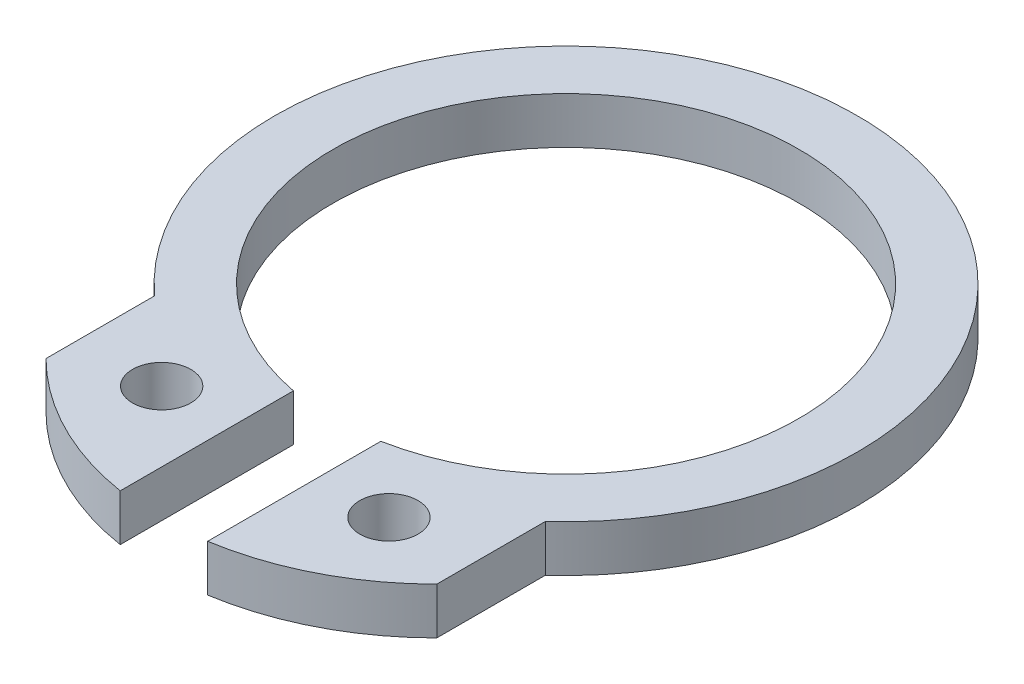
ISO-10303-21;
HEADER;
FILE_DESCRIPTION(('STEP AP214'),'2;1');
FILE_NAME('part.step','',(''),(''),'','','');
FILE_SCHEMA(('AUTOMOTIVE_DESIGN { 1 0 10303 214 1 1 1 1 }'));
ENDSEC;
DATA;
#1=APPLICATION_CONTEXT('core data for automotive mechanical design processes');
#2=APPLICATION_PROTOCOL_DEFINITION('international standard','automotive_design',2000,#1);
#3=PRODUCT_CONTEXT('',#1,'mechanical');
#4=PRODUCT('Part','Part','',(#3));
#5=PRODUCT_RELATED_PRODUCT_CATEGORY('part','',(#4));
#6=PRODUCT_DEFINITION_FORMATION('','',#4);
#7=PRODUCT_DEFINITION_CONTEXT('part definition',#1,'design');
#8=PRODUCT_DEFINITION('design','',#6,#7);
#9=PRODUCT_DEFINITION_SHAPE('','',#8);
#10=(LENGTH_UNIT() NAMED_UNIT(*) SI_UNIT(.MILLI.,.METRE.));
#11=(NAMED_UNIT(*) PLANE_ANGLE_UNIT() SI_UNIT($,.RADIAN.));
#12=(NAMED_UNIT(*) SI_UNIT($,.STERADIAN.) SOLID_ANGLE_UNIT());
#13=UNCERTAINTY_MEASURE_WITH_UNIT(LENGTH_MEASURE(1.E-05),#10,'distance_accuracy_value','');
#14=(GEOMETRIC_REPRESENTATION_CONTEXT(3) GLOBAL_UNCERTAINTY_ASSIGNED_CONTEXT((#13)) GLOBAL_UNIT_ASSIGNED_CONTEXT((#10,
#11,#12)) REPRESENTATION_CONTEXT('',''));
#15=CARTESIAN_POINT('',(0.,0.,0.));
#16=DIRECTION('',(0.,0.,1.));
#17=DIRECTION('',(1.,0.,0.));
#18=AXIS2_PLACEMENT_3D('',#15,#16,#17);
#19=CARTESIAN_POINT('',(0.,0.8,0.));
#20=DIRECTION('',(0.,-1.,0.));
#21=DIRECTION('',(0.,0.,-1.));
#22=AXIS2_PLACEMENT_3D('',#19,#20,#21);
#23=CYLINDRICAL_SURFACE('',#22,4.);
#24=CARTESIAN_POINT('',(0.,0.,0.));
#25=DIRECTION('',(0.,1.,0.));
#26=DIRECTION('',(0.,0.,1.));
#27=AXIS2_PLACEMENT_3D('',#24,#25,#26);
#28=CIRCLE('',#27,4.);
#29=CARTESIAN_POINT('',(0.750000000000001,0.,3.92905841137543));
#30=VERTEX_POINT('',#29);
#31=CARTESIAN_POINT('',(-0.749999999999999,0.,3.92905841137543));
#32=VERTEX_POINT('',#31);
#33=EDGE_CURVE('E152',#30,#32,#28,.T.);
#34=ORIENTED_EDGE('',*,*,#33,.F.);
#35=DIRECTION('',(0.,-1.,0.));
#36=VECTOR('',#35,1.);
#37=CARTESIAN_POINT('',(0.750000000000001,0.8,3.92905841137543));
#38=LINE('',#37,#36);
#39=CARTESIAN_POINT('',(0.750000000000001,0.8,3.92905841137543));
#40=VERTEX_POINT('',#39);
#41=EDGE_CURVE('E11',#40,#30,#38,.T.);
#42=ORIENTED_EDGE('',*,*,#41,.F.);
#43=CARTESIAN_POINT('',(0.,0.8,0.));
#44=DIRECTION('',(0.,1.,0.));
#45=DIRECTION('',(0.,0.,1.));
#46=AXIS2_PLACEMENT_3D('',#43,#44,#45);
#47=CIRCLE('',#46,4.);
#48=CARTESIAN_POINT('',(-0.749999999999999,0.8,3.92905841137543));
#49=VERTEX_POINT('',#48);
#50=EDGE_CURVE('E186',#40,#49,#47,.T.);
#51=ORIENTED_EDGE('',*,*,#50,.T.);
#52=DIRECTION('',(0.,-1.,0.));
#53=VECTOR('',#52,1.);
#54=CARTESIAN_POINT('',(-0.749999999999999,0.8,3.92905841137543));
#55=LINE('',#54,#53);
#56=EDGE_CURVE('E97',#49,#32,#55,.T.);
#57=ORIENTED_EDGE('',*,*,#56,.T.);
#58=EDGE_LOOP('',(#34,#42,#51,#57));
#59=FACE_BOUND('',#58,.T.);
#60=ADVANCED_FACE('F45',(#59),#23,.F.);
#61=CARTESIAN_POINT('',(0.750000000000001,0.8,0.));
#62=DIRECTION('',(-1.,0.,0.));
#63=DIRECTION('',(0.,0.,1.));
#64=AXIS2_PLACEMENT_3D('',#61,#62,#63);
#65=PLANE('',#64);
#66=DIRECTION('',(0.,0.,-1.));
#67=VECTOR('',#66,1.);
#68=CARTESIAN_POINT('',(0.750000000000001,0.,0.));
#69=LINE('',#68,#67);
#70=CARTESIAN_POINT('',(0.750000000000001,0.,6.90181330035172));
#71=VERTEX_POINT('',#70);
#72=EDGE_CURVE('E156',#71,#30,#69,.T.);
#73=ORIENTED_EDGE('',*,*,#72,.F.);
#74=DIRECTION('',(0.,-1.,0.));
#75=VECTOR('',#74,1.);
#76=CARTESIAN_POINT('',(0.750000000000001,0.8,6.90181330035172));
#77=LINE('',#76,#75);
#78=CARTESIAN_POINT('',(0.750000000000001,0.8,6.90181330035172));
#79=VERTEX_POINT('',#78);
#80=EDGE_CURVE('E54',#79,#71,#77,.T.);
#81=ORIENTED_EDGE('',*,*,#80,.F.);
#82=DIRECTION('',(0.,0.,-1.));
#83=VECTOR('',#82,1.);
#84=CARTESIAN_POINT('',(0.750000000000001,0.8,0.));
#85=LINE('',#84,#83);
#86=EDGE_CURVE('E215',#79,#40,#85,.T.);
#87=ORIENTED_EDGE('',*,*,#86,.T.);
#88=ORIENTED_EDGE('',*,*,#41,.T.);
#89=EDGE_LOOP('',(#73,#81,#87,#88));
#90=FACE_BOUND('',#89,.T.);
#91=ADVANCED_FACE('F214',(#90),#65,.T.);
#92=CARTESIAN_POINT('',(0.,0.8,2.21907270884503));
#93=DIRECTION('',(0.,-1.,0.));
#94=DIRECTION('',(0.,0.,-1.));
#95=AXIS2_PLACEMENT_3D('',#92,#93,#94);
#96=CYLINDRICAL_SURFACE('',#95,4.74242126422194);
#97=CARTESIAN_POINT('',(0.,0.,2.21907270884503));
#98=DIRECTION('',(0.,1.,0.));
#99=DIRECTION('',(0.,0.,1.));
#100=AXIS2_PLACEMENT_3D('',#97,#98,#99);
#101=CIRCLE('',#100,4.74242126422194);
#102=CARTESIAN_POINT('',(3.35339823517462,0.,5.57247094401964));
#103=VERTEX_POINT('',#102);
#104=EDGE_CURVE('E160',#71,#103,#101,.T.);
#105=ORIENTED_EDGE('',*,*,#104,.T.);
#106=DIRECTION('',(0.,-1.,0.));
#107=VECTOR('',#106,1.);
#108=CARTESIAN_POINT('',(3.35339823517462,0.8,5.57247094401964));
#109=LINE('',#108,#107);
#110=CARTESIAN_POINT('',(3.35339823517462,0.8,5.57247094401964));
#111=VERTEX_POINT('',#110);
#112=EDGE_CURVE('E196',#111,#103,#109,.T.);
#113=ORIENTED_EDGE('',*,*,#112,.F.);
#114=CARTESIAN_POINT('',(0.,0.8,2.21907270884503));
#115=DIRECTION('',(0.,1.,0.));
#116=DIRECTION('',(0.,0.,1.));
#117=AXIS2_PLACEMENT_3D('',#114,#115,#116);
#118=CIRCLE('',#117,4.74242126422194);
#119=EDGE_CURVE('E204',#79,#111,#118,.T.);
#120=ORIENTED_EDGE('',*,*,#119,.F.);
#121=ORIENTED_EDGE('',*,*,#80,.T.);
#122=EDGE_LOOP('',(#105,#113,#120,#121));
#123=FACE_BOUND('',#122,.T.);
#124=ADVANCED_FACE('F202',(#123),#96,.T.);
#125=CARTESIAN_POINT('',(3.35339823517462,0.8,0.));
#126=DIRECTION('',(1.,0.,0.));
#127=DIRECTION('',(0.,0.,-1.));
#128=AXIS2_PLACEMENT_3D('',#125,#126,#127);
#129=PLANE('',#128);
#130=DIRECTION('',(0.,0.,1.));
#131=VECTOR('',#130,1.);
#132=CARTESIAN_POINT('',(3.35339823517462,0.,0.));
#133=LINE('',#132,#131);
#134=CARTESIAN_POINT('',(3.35339823517462,0.,3.70873567086248));
#135=VERTEX_POINT('',#134);
#136=EDGE_CURVE('E164',#135,#103,#133,.T.);
#137=ORIENTED_EDGE('',*,*,#136,.F.);
#138=DIRECTION('',(0.,-1.,0.));
#139=VECTOR('',#138,1.);
#140=CARTESIAN_POINT('',(3.35339823517462,0.8,3.70873567086248));
#141=LINE('',#140,#139);
#142=CARTESIAN_POINT('',(3.35339823517462,0.8,3.70873567086248));
#143=VERTEX_POINT('',#142);
#144=EDGE_CURVE('E193',#143,#135,#141,.T.);
#145=ORIENTED_EDGE('',*,*,#144,.F.);
#146=DIRECTION('',(0.,0.,1.));
#147=VECTOR('',#146,1.);
#148=CARTESIAN_POINT('',(3.35339823517462,0.8,0.));
#149=LINE('',#148,#147);
#150=EDGE_CURVE('E226',#143,#111,#149,.T.);
#151=ORIENTED_EDGE('',*,*,#150,.T.);
#152=ORIENTED_EDGE('',*,*,#112,.T.);
#153=EDGE_LOOP('',(#137,#145,#151,#152));
#154=FACE_BOUND('',#153,.T.);
#155=ADVANCED_FACE('F231',(#154),#129,.T.);
#156=CARTESIAN_POINT('',(0.,0.8,0.));
#157=DIRECTION('',(0.,-1.,0.));
#158=DIRECTION('',(0.,0.,-1.));
#159=AXIS2_PLACEMENT_3D('',#156,#157,#158);
#160=CYLINDRICAL_SURFACE('',#159,5.);
#161=CARTESIAN_POINT('',(0.,0.,0.));
#162=DIRECTION('',(0.,1.,0.));
#163=DIRECTION('',(0.,0.,1.));
#164=AXIS2_PLACEMENT_3D('',#161,#162,#163);
#165=CIRCLE('',#164,5.);
#166=CARTESIAN_POINT('',(-3.35339823517462,0.,3.70873567086248));
#167=VERTEX_POINT('',#166);
#168=EDGE_CURVE('E168',#135,#167,#165,.T.);
#169=ORIENTED_EDGE('',*,*,#168,.T.);
#170=DIRECTION('',(0.,-1.,0.));
#171=VECTOR('',#170,1.);
#172=CARTESIAN_POINT('',(-3.35339823517462,0.8,3.70873567086248));
#173=LINE('',#172,#171);
#174=CARTESIAN_POINT('',(-3.35339823517462,0.8,3.70873567086248));
#175=VERTEX_POINT('',#174);
#176=EDGE_CURVE('E134',#175,#167,#173,.T.);
#177=ORIENTED_EDGE('',*,*,#176,.F.);
#178=CARTESIAN_POINT('',(0.,0.8,0.));
#179=DIRECTION('',(0.,1.,0.));
#180=DIRECTION('',(0.,0.,1.));
#181=AXIS2_PLACEMENT_3D('',#178,#179,#180);
#182=CIRCLE('',#181,5.);
#183=EDGE_CURVE('E123',#143,#175,#182,.T.);
#184=ORIENTED_EDGE('',*,*,#183,.F.);
#185=ORIENTED_EDGE('',*,*,#144,.T.);
#186=EDGE_LOOP('',(#169,#177,#184,#185));
#187=FACE_BOUND('',#186,.T.);
#188=ADVANCED_FACE('F233',(#187),#160,.T.);
#189=CARTESIAN_POINT('',(-3.35339823517462,0.8,0.));
#190=DIRECTION('',(1.,0.,0.));
#191=DIRECTION('',(0.,0.,-1.));
#192=AXIS2_PLACEMENT_3D('',#189,#190,#191);
#193=PLANE('',#192);
#194=DIRECTION('',(0.,0.,1.));
#195=VECTOR('',#194,1.);
#196=CARTESIAN_POINT('',(-3.35339823517462,0.,0.));
#197=LINE('',#196,#195);
#198=CARTESIAN_POINT('',(-3.35339823517462,0.,5.57247094401964));
#199=VERTEX_POINT('',#198);
#200=EDGE_CURVE('E132',#167,#199,#197,.T.);
#201=ORIENTED_EDGE('',*,*,#200,.T.);
#202=DIRECTION('',(0.,-1.,0.));
#203=VECTOR('',#202,1.);
#204=CARTESIAN_POINT('',(-3.35339823517462,0.8,5.57247094401964));
#205=LINE('',#204,#203);
#206=CARTESIAN_POINT('',(-3.35339823517462,0.8,5.57247094401964));
#207=VERTEX_POINT('',#206);
#208=EDGE_CURVE('E129',#207,#199,#205,.T.);
#209=ORIENTED_EDGE('',*,*,#208,.F.);
#210=DIRECTION('',(0.,0.,1.));
#211=VECTOR('',#210,1.);
#212=CARTESIAN_POINT('',(-3.35339823517462,0.8,0.));
#213=LINE('',#212,#211);
#214=EDGE_CURVE('E115',#175,#207,#213,.T.);
#215=ORIENTED_EDGE('',*,*,#214,.F.);
#216=ORIENTED_EDGE('',*,*,#176,.T.);
#217=EDGE_LOOP('',(#201,#209,#215,#216));
#218=FACE_BOUND('',#217,.T.);
#219=ADVANCED_FACE('F130',(#218),#193,.F.);
#220=CARTESIAN_POINT('',(0.,0.8,2.21907270884503));
#221=DIRECTION('',(0.,-1.,0.));
#222=DIRECTION('',(0.,0.,-1.));
#223=AXIS2_PLACEMENT_3D('',#220,#221,#222);
#224=CYLINDRICAL_SURFACE('',#223,4.74242126422194);
#225=CARTESIAN_POINT('',(0.,0.,2.21907270884503));
#226=DIRECTION('',(0.,1.,0.));
#227=DIRECTION('',(0.,0.,1.));
#228=AXIS2_PLACEMENT_3D('',#225,#226,#227);
#229=CIRCLE('',#228,4.74242126422194);
#230=CARTESIAN_POINT('',(-0.749999999999999,0.,6.90181330035172));
#231=VERTEX_POINT('',#230);
#232=EDGE_CURVE('E90',#199,#231,#229,.T.);
#233=ORIENTED_EDGE('',*,*,#232,.T.);
#234=DIRECTION('',(0.,-1.,0.));
#235=VECTOR('',#234,1.);
#236=CARTESIAN_POINT('',(-0.749999999999999,0.8,6.90181330035172));
#237=LINE('',#236,#235);
#238=CARTESIAN_POINT('',(-0.749999999999999,0.8,6.90181330035172));
#239=VERTEX_POINT('',#238);
#240=EDGE_CURVE('E135',#239,#231,#237,.T.);
#241=ORIENTED_EDGE('',*,*,#240,.F.);
#242=CARTESIAN_POINT('',(0.,0.8,2.21907270884503));
#243=DIRECTION('',(0.,1.,0.));
#244=DIRECTION('',(0.,0.,1.));
#245=AXIS2_PLACEMENT_3D('',#242,#243,#244);
#246=CIRCLE('',#245,4.74242126422194);
#247=EDGE_CURVE('E120',#207,#239,#246,.T.);
#248=ORIENTED_EDGE('',*,*,#247,.F.);
#249=ORIENTED_EDGE('',*,*,#208,.T.);
#250=EDGE_LOOP('',(#233,#241,#248,#249));
#251=FACE_BOUND('',#250,.T.);
#252=ADVANCED_FACE('F137',(#251),#224,.T.);
#253=CARTESIAN_POINT('',(-1.95,0.8,4.99060976580415));
#254=DIRECTION('',(0.,-1.,0.));
#255=DIRECTION('',(0.,0.,-1.));
#256=AXIS2_PLACEMENT_3D('',#253,#254,#255);
#257=CYLINDRICAL_SURFACE('',#256,0.5);
#258=CARTESIAN_POINT('',(-1.95,0.8,4.99060976580415));
#259=DIRECTION('',(0.,1.,0.));
#260=DIRECTION('',(0.,0.,1.));
#261=AXIS2_PLACEMENT_3D('',#258,#259,#260);
#262=CIRCLE('',#261,0.5);
#263=CARTESIAN_POINT('',(-1.95,0.8,5.49060976580415));
#264=VERTEX_POINT('',#263);
#265=EDGE_CURVE('E141',#264,#264,#262,.T.);
#266=ORIENTED_EDGE('',*,*,#265,.T.);
#267=EDGE_LOOP('',(#266));
#268=FACE_BOUND('',#267,.T.);
#269=CARTESIAN_POINT('',(-1.95,0.,4.99060976580415));
#270=DIRECTION('',(0.,1.,0.));
#271=DIRECTION('',(0.,0.,1.));
#272=AXIS2_PLACEMENT_3D('',#269,#270,#271);
#273=CIRCLE('',#272,0.5);
#274=CARTESIAN_POINT('',(-1.95,0.,5.49060976580415));
#275=VERTEX_POINT('',#274);
#276=EDGE_CURVE('E178',#275,#275,#273,.T.);
#277=ORIENTED_EDGE('',*,*,#276,.F.);
#278=EDGE_LOOP('',(#277));
#279=FACE_BOUND('',#278,.T.);
#280=ADVANCED_FACE('F278',(#268,#279),#257,.F.);
#281=CARTESIAN_POINT('',(-0.749999999999999,0.8,0.));
#282=DIRECTION('',(-1.,0.,0.));
#283=DIRECTION('',(0.,0.,1.));
#284=AXIS2_PLACEMENT_3D('',#281,#282,#283);
#285=PLANE('',#284);
#286=DIRECTION('',(0.,0.,-1.));
#287=VECTOR('',#286,1.);
#288=CARTESIAN_POINT('',(-0.749999999999999,0.,0.));
#289=LINE('',#288,#287);
#290=EDGE_CURVE('E175',#231,#32,#289,.T.);
#291=ORIENTED_EDGE('',*,*,#290,.T.);
#292=ORIENTED_EDGE('',*,*,#56,.F.);
#293=DIRECTION('',(0.,0.,-1.));
#294=VECTOR('',#293,1.);
#295=CARTESIAN_POINT('',(-0.749999999999999,0.8,0.));
#296=LINE('',#295,#294);
#297=EDGE_CURVE('E62',#239,#49,#296,.T.);
#298=ORIENTED_EDGE('',*,*,#297,.F.);
#299=ORIENTED_EDGE('',*,*,#240,.T.);
#300=EDGE_LOOP('',(#291,#292,#298,#299));
#301=FACE_BOUND('',#300,.T.);
#302=ADVANCED_FACE('F218',(#301),#285,.F.);
#303=CARTESIAN_POINT('',(1.95,0.8,4.99060976580415));
#304=DIRECTION('',(0.,-1.,0.));
#305=DIRECTION('',(0.,0.,-1.));
#306=AXIS2_PLACEMENT_3D('',#303,#304,#305);
#307=CYLINDRICAL_SURFACE('',#306,0.5);
#308=CARTESIAN_POINT('',(1.95,0.8,4.99060976580415));
#309=DIRECTION('',(0.,1.,0.));
#310=DIRECTION('',(0.,0.,1.));
#311=AXIS2_PLACEMENT_3D('',#308,#309,#310);
#312=CIRCLE('',#311,0.5);
#313=CARTESIAN_POINT('',(1.95,0.8,5.49060976580415));
#314=VERTEX_POINT('',#313);
#315=EDGE_CURVE('E148',#314,#314,#312,.T.);
#316=ORIENTED_EDGE('',*,*,#315,.T.);
#317=EDGE_LOOP('',(#316));
#318=FACE_BOUND('',#317,.T.);
#319=CARTESIAN_POINT('',(1.95,0.,4.99060976580415));
#320=DIRECTION('',(0.,1.,0.));
#321=DIRECTION('',(0.,0.,1.));
#322=AXIS2_PLACEMENT_3D('',#319,#320,#321);
#323=CIRCLE('',#322,0.5);
#324=CARTESIAN_POINT('',(1.95,0.,5.49060976580415));
#325=VERTEX_POINT('',#324);
#326=EDGE_CURVE('E182',#325,#325,#323,.T.);
#327=ORIENTED_EDGE('',*,*,#326,.F.);
#328=EDGE_LOOP('',(#327));
#329=FACE_BOUND('',#328,.T.);
#330=ADVANCED_FACE('F298',(#318,#329),#307,.F.);
#331=CARTESIAN_POINT('',(0.,0.8,0.));
#332=DIRECTION('',(0.,1.,0.));
#333=DIRECTION('',(0.,0.,1.));
#334=AXIS2_PLACEMENT_3D('',#331,#332,#333);
#335=PLANE('',#334);
#336=ORIENTED_EDGE('',*,*,#50,.F.);
#337=ORIENTED_EDGE('',*,*,#86,.F.);
#338=ORIENTED_EDGE('',*,*,#119,.T.);
#339=ORIENTED_EDGE('',*,*,#150,.F.);
#340=ORIENTED_EDGE('',*,*,#183,.T.);
#341=ORIENTED_EDGE('',*,*,#214,.T.);
#342=ORIENTED_EDGE('',*,*,#247,.T.);
#343=ORIENTED_EDGE('',*,*,#297,.T.);
#344=EDGE_LOOP('',(#336,#337,#338,#339,#340,#341,#342,#343));
#345=FACE_BOUND('',#344,.T.);
#346=ORIENTED_EDGE('',*,*,#265,.F.);
#347=EDGE_LOOP('',(#346));
#348=FACE_BOUND('',#347,.T.);
#349=ORIENTED_EDGE('',*,*,#315,.F.);
#350=EDGE_LOOP('',(#349));
#351=FACE_BOUND('',#350,.T.);
#352=ADVANCED_FACE('F117',(#345,#348,#351),#335,.T.);
#353=CARTESIAN_POINT('',(0.,0.,0.));
#354=DIRECTION('',(0.,1.,0.));
#355=DIRECTION('',(0.,0.,1.));
#356=AXIS2_PLACEMENT_3D('',#353,#354,#355);
#357=PLANE('',#356);
#358=ORIENTED_EDGE('',*,*,#33,.T.);
#359=ORIENTED_EDGE('',*,*,#290,.F.);
#360=ORIENTED_EDGE('',*,*,#232,.F.);
#361=ORIENTED_EDGE('',*,*,#200,.F.);
#362=ORIENTED_EDGE('',*,*,#168,.F.);
#363=ORIENTED_EDGE('',*,*,#136,.T.);
#364=ORIENTED_EDGE('',*,*,#104,.F.);
#365=ORIENTED_EDGE('',*,*,#72,.T.);
#366=EDGE_LOOP('',(#358,#359,#360,#361,#362,#363,#364,#365));
#367=FACE_BOUND('',#366,.T.);
#368=ORIENTED_EDGE('',*,*,#276,.T.);
#369=EDGE_LOOP('',(#368));
#370=FACE_BOUND('',#369,.T.);
#371=ORIENTED_EDGE('',*,*,#326,.T.);
#372=EDGE_LOOP('',(#371));
#373=FACE_BOUND('',#372,.T.);
#374=ADVANCED_FACE('F210',(#367,#370,#373),#357,.F.);
#375=CLOSED_SHELL('',(#60,#91,#124,#155,#188,#219,#252,#280,#302,#330,#352,#374));
#376=MANIFOLD_SOLID_BREP('B2',#375);
#377=ADVANCED_BREP_SHAPE_REPRESENTATION('',(#18,#376),#14);
#378=SHAPE_DEFINITION_REPRESENTATION(#9,#377);
ENDSEC;
END-ISO-10303-21;
